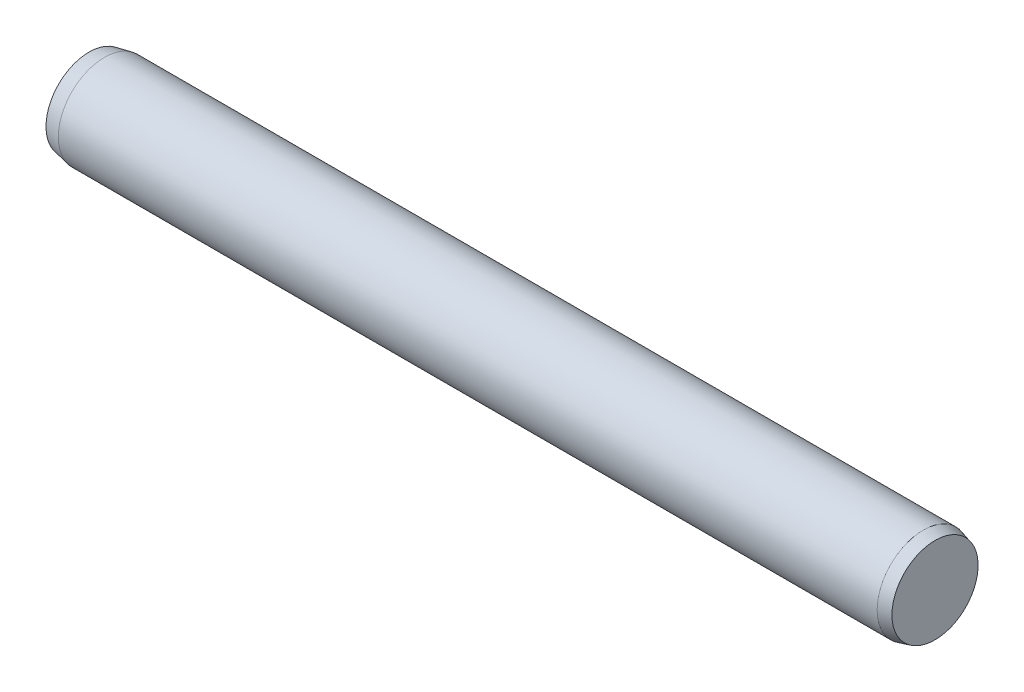
ISO-10303-21;
HEADER;
FILE_DESCRIPTION(('STEP AP214'),'2;1');
FILE_NAME('part.step','',(''),(''),'','','');
FILE_SCHEMA(('AUTOMOTIVE_DESIGN { 1 0 10303 214 1 1 1 1 }'));
ENDSEC;
DATA;
#1=APPLICATION_CONTEXT('core data for automotive mechanical design processes');
#2=APPLICATION_PROTOCOL_DEFINITION('international standard','automotive_design',2000,#1);
#3=PRODUCT_CONTEXT('',#1,'mechanical');
#4=PRODUCT('Part','Part','',(#3));
#5=PRODUCT_RELATED_PRODUCT_CATEGORY('part','',(#4));
#6=PRODUCT_DEFINITION_FORMATION('','',#4);
#7=PRODUCT_DEFINITION_CONTEXT('part definition',#1,'design');
#8=PRODUCT_DEFINITION('design','',#6,#7);
#9=PRODUCT_DEFINITION_SHAPE('','',#8);
#10=(LENGTH_UNIT() NAMED_UNIT(*) SI_UNIT(.MILLI.,.METRE.));
#11=(NAMED_UNIT(*) PLANE_ANGLE_UNIT() SI_UNIT($,.RADIAN.));
#12=(NAMED_UNIT(*) SI_UNIT($,.STERADIAN.) SOLID_ANGLE_UNIT());
#13=UNCERTAINTY_MEASURE_WITH_UNIT(LENGTH_MEASURE(1.E-05),#10,'distance_accuracy_value','');
#14=(GEOMETRIC_REPRESENTATION_CONTEXT(3) GLOBAL_UNCERTAINTY_ASSIGNED_CONTEXT((#13)) GLOBAL_UNIT_ASSIGNED_CONTEXT((#10,
#11,#12)) REPRESENTATION_CONTEXT('',''));
#15=CARTESIAN_POINT('',(0.,0.,0.));
#16=DIRECTION('',(0.,0.,1.));
#17=DIRECTION('',(1.,0.,0.));
#18=AXIS2_PLACEMENT_3D('',#15,#16,#17);
#19=CARTESIAN_POINT('',(75.4380000000004,0.400399999999662,0.));
#20=DIRECTION('',(-1.,0.,0.));
#21=DIRECTION('',(0.,0.,1.));
#22=AXIS2_PLACEMENT_3D('',#19,#20,#21);
#23=CONICAL_SURFACE('',#22,2.99999999999999,0.256677636756343);
#24=CARTESIAN_POINT('',(76.2000000000002,0.400399999999662,0.));
#25=DIRECTION('',(-1.,0.,0.));
#26=DIRECTION('',(0.,0.,1.));
#27=AXIS2_PLACEMENT_3D('',#24,#25,#26);
#28=CIRCLE('',#27,2.8);
#29=CARTESIAN_POINT('',(76.2000000000002,0.400399999999662,2.79999999999998));
#30=VERTEX_POINT('',#29);
#31=EDGE_CURVE('E10',#30,#30,#28,.T.);
#32=ORIENTED_EDGE('',*,*,#31,.T.);
#33=EDGE_LOOP('',(#32));
#34=FACE_BOUND('',#33,.T.);
#35=CARTESIAN_POINT('',(75.4380000000004,0.400399999999662,0.));
#36=DIRECTION('',(-1.,0.,0.));
#37=DIRECTION('',(0.,0.,1.));
#38=AXIS2_PLACEMENT_3D('',#35,#36,#37);
#39=CIRCLE('',#38,2.99999999999999);
#40=CARTESIAN_POINT('',(75.4380000000004,0.400399999999662,2.99999999999997));
#41=VERTEX_POINT('',#40);
#42=EDGE_CURVE('E55',#41,#41,#39,.T.);
#43=ORIENTED_EDGE('',*,*,#42,.F.);
#44=EDGE_LOOP('',(#43));
#45=FACE_BOUND('',#44,.T.);
#46=ADVANCED_FACE('F41',(#34,#45),#23,.T.);
#47=CARTESIAN_POINT('',(76.2000000000002,3.20039999999966,0.));
#48=DIRECTION('',(1.,0.,0.));
#49=DIRECTION('',(0.,0.,-1.));
#50=AXIS2_PLACEMENT_3D('',#47,#48,#49);
#51=PLANE('',#50);
#52=ORIENTED_EDGE('',*,*,#31,.F.);
#53=EDGE_LOOP('',(#52));
#54=FACE_BOUND('',#53,.T.);
#55=ADVANCED_FACE('F65',(#54),#51,.T.);
#56=CARTESIAN_POINT('',(21.2000000000002,0.400399999999662,0.));
#57=DIRECTION('',(-1.,0.,0.));
#58=DIRECTION('',(0.,0.,1.));
#59=AXIS2_PLACEMENT_3D('',#56,#57,#58);
#60=PLANE('',#59);
#61=CARTESIAN_POINT('',(21.2000000000002,0.400399999999662,0.));
#62=DIRECTION('',(-1.,0.,0.));
#63=DIRECTION('',(0.,0.,1.));
#64=AXIS2_PLACEMENT_3D('',#61,#62,#63);
#65=CIRCLE('',#64,2.8);
#66=CARTESIAN_POINT('',(21.2000000000002,0.400399999999662,2.79999999999999));
#67=VERTEX_POINT('',#66);
#68=EDGE_CURVE('E47',#67,#67,#65,.T.);
#69=ORIENTED_EDGE('',*,*,#68,.T.);
#70=EDGE_LOOP('',(#69));
#71=FACE_BOUND('',#70,.T.);
#72=ADVANCED_FACE('F69',(#71),#60,.T.);
#73=CARTESIAN_POINT('',(21.2000000000002,0.400399999999662,0.));
#74=DIRECTION('',(1.,0.,0.));
#75=DIRECTION('',(0.,0.,-1.));
#76=AXIS2_PLACEMENT_3D('',#73,#74,#75);
#77=CONICAL_SURFACE('',#76,2.8,0.197395559849881);
#78=CARTESIAN_POINT('',(22.2000000000002,0.400399999999662,0.));
#79=DIRECTION('',(-1.,0.,0.));
#80=DIRECTION('',(0.,0.,1.));
#81=AXIS2_PLACEMENT_3D('',#78,#79,#80);
#82=CIRCLE('',#81,3.);
#83=CARTESIAN_POINT('',(22.2000000000002,0.400399999999662,2.99999999999999));
#84=VERTEX_POINT('',#83);
#85=EDGE_CURVE('E51',#84,#84,#82,.T.);
#86=ORIENTED_EDGE('',*,*,#85,.T.);
#87=EDGE_LOOP('',(#86));
#88=FACE_BOUND('',#87,.T.);
#89=ORIENTED_EDGE('',*,*,#68,.F.);
#90=EDGE_LOOP('',(#89));
#91=FACE_BOUND('',#90,.T.);
#92=ADVANCED_FACE('F74',(#88,#91),#77,.T.);
#93=CARTESIAN_POINT('',(76.2000000000002,0.400399999999662,0.));
#94=DIRECTION('',(-1.,0.,0.));
#95=DIRECTION('',(0.,0.,1.));
#96=AXIS2_PLACEMENT_3D('',#93,#94,#95);
#97=CYLINDRICAL_SURFACE('',#96,3.);
#98=ORIENTED_EDGE('',*,*,#42,.T.);
#99=EDGE_LOOP('',(#98));
#100=FACE_BOUND('',#99,.T.);
#101=ORIENTED_EDGE('',*,*,#85,.F.);
#102=EDGE_LOOP('',(#101));
#103=FACE_BOUND('',#102,.T.);
#104=ADVANCED_FACE('F61',(#100,#103),#97,.T.);
#105=CLOSED_SHELL('',(#46,#55,#72,#92,#104));
#106=MANIFOLD_SOLID_BREP('B2',#105);
#107=ADVANCED_BREP_SHAPE_REPRESENTATION('',(#18,#106),#14);
#108=SHAPE_DEFINITION_REPRESENTATION(#9,#107);
ENDSEC;
END-ISO-10303-21;
